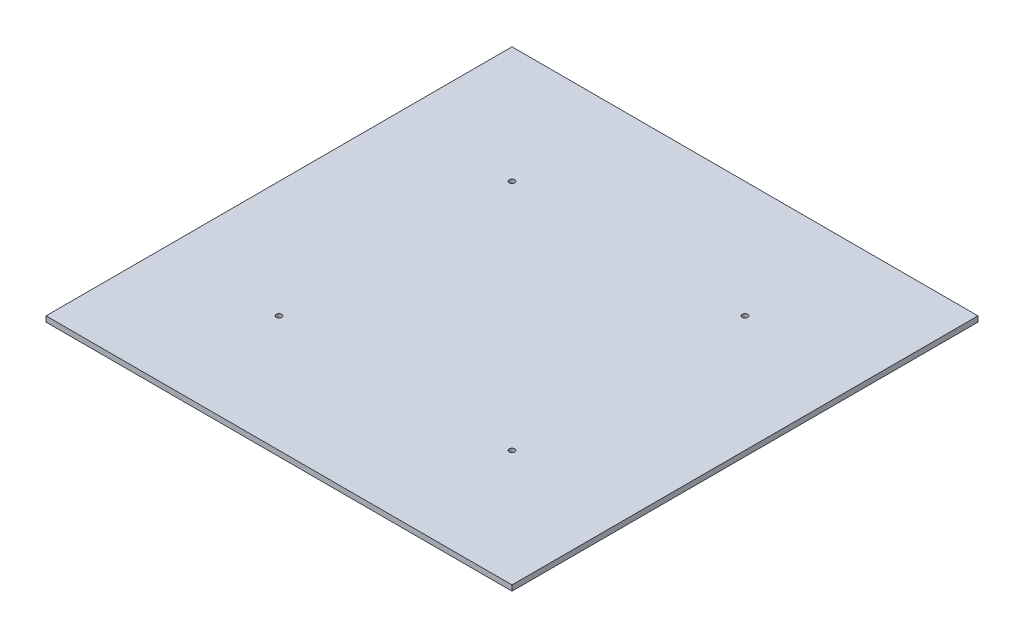
ISO-10303-21;
HEADER;
FILE_DESCRIPTION(('STEP AP214'),'2;1');
FILE_NAME('part.step','',(''),(''),'','','');
FILE_SCHEMA(('AUTOMOTIVE_DESIGN { 1 0 10303 214 1 1 1 1 }'));
ENDSEC;
DATA;
#1=APPLICATION_CONTEXT('core data for automotive mechanical design processes');
#2=APPLICATION_PROTOCOL_DEFINITION('international standard','automotive_design',2000,#1);
#3=PRODUCT_CONTEXT('',#1,'mechanical');
#4=PRODUCT('Part','Part','',(#3));
#5=PRODUCT_RELATED_PRODUCT_CATEGORY('part','',(#4));
#6=PRODUCT_DEFINITION_FORMATION('','',#4);
#7=PRODUCT_DEFINITION_CONTEXT('part definition',#1,'design');
#8=PRODUCT_DEFINITION('design','',#6,#7);
#9=PRODUCT_DEFINITION_SHAPE('','',#8);
#10=(LENGTH_UNIT() NAMED_UNIT(*) SI_UNIT(.MILLI.,.METRE.));
#11=(NAMED_UNIT(*) PLANE_ANGLE_UNIT() SI_UNIT($,.RADIAN.));
#12=(NAMED_UNIT(*) SI_UNIT($,.STERADIAN.) SOLID_ANGLE_UNIT());
#13=UNCERTAINTY_MEASURE_WITH_UNIT(LENGTH_MEASURE(1.E-05),#10,'distance_accuracy_value','');
#14=(GEOMETRIC_REPRESENTATION_CONTEXT(3) GLOBAL_UNCERTAINTY_ASSIGNED_CONTEXT((#13)) GLOBAL_UNIT_ASSIGNED_CONTEXT((#10,
#11,#12)) REPRESENTATION_CONTEXT('',''));
#15=CARTESIAN_POINT('',(0.,0.,0.));
#16=DIRECTION('',(0.,0.,1.));
#17=DIRECTION('',(1.,0.,0.));
#18=AXIS2_PLACEMENT_3D('',#15,#16,#17);
#19=CARTESIAN_POINT('',(0.,1.5,0.));
#20=DIRECTION('',(0.,-1.,0.));
#21=DIRECTION('',(0.,0.,-1.));
#22=AXIS2_PLACEMENT_3D('',#19,#20,#21);
#23=PLANE('',#22);
#24=DIRECTION('',(0.,0.,-1.));
#25=VECTOR('',#24,1.);
#26=CARTESIAN_POINT('',(128.,1.5,128.));
#27=LINE('',#26,#25);
#28=CARTESIAN_POINT('',(128.,1.5,128.));
#29=VERTEX_POINT('',#28);
#30=CARTESIAN_POINT('',(128.,1.5,-128.));
#31=VERTEX_POINT('',#30);
#32=EDGE_CURVE('E84',#29,#31,#27,.T.);
#33=ORIENTED_EDGE('',*,*,#32,.T.);
#34=DIRECTION('',(-1.,0.,0.));
#35=VECTOR('',#34,1.);
#36=CARTESIAN_POINT('',(-128.,1.5,-128.));
#37=LINE('',#36,#35);
#38=CARTESIAN_POINT('',(-128.,1.5,-128.));
#39=VERTEX_POINT('',#38);
#40=EDGE_CURVE('E79',#31,#39,#37,.T.);
#41=ORIENTED_EDGE('',*,*,#40,.T.);
#42=DIRECTION('',(0.,0.,1.));
#43=VECTOR('',#42,1.);
#44=CARTESIAN_POINT('',(-128.,1.5,128.));
#45=LINE('',#44,#43);
#46=CARTESIAN_POINT('',(-128.,1.5,128.));
#47=VERTEX_POINT('',#46);
#48=EDGE_CURVE('E82',#39,#47,#45,.T.);
#49=ORIENTED_EDGE('',*,*,#48,.T.);
#50=DIRECTION('',(1.,0.,0.));
#51=VECTOR('',#50,1.);
#52=CARTESIAN_POINT('',(-128.,1.5,128.));
#53=LINE('',#52,#51);
#54=EDGE_CURVE('E49',#47,#29,#53,.T.);
#55=ORIENTED_EDGE('',*,*,#54,.T.);
#56=EDGE_LOOP('',(#33,#41,#49,#55));
#57=FACE_BOUND('',#56,.T.);
#58=CARTESIAN_POINT('',(-64.,1.5,-64.));
#59=DIRECTION('',(0.,1.,0.));
#60=DIRECTION('',(0.,0.,1.));
#61=AXIS2_PLACEMENT_3D('',#58,#59,#60);
#62=CIRCLE('',#61,1.5);
#63=CARTESIAN_POINT('',(-64.,1.5,-62.5));
#64=VERTEX_POINT('',#63);
#65=EDGE_CURVE('E99',#64,#64,#62,.T.);
#66=ORIENTED_EDGE('',*,*,#65,.F.);
#67=EDGE_LOOP('',(#66));
#68=FACE_BOUND('',#67,.T.);
#69=CARTESIAN_POINT('',(64.,1.5,-64.));
#70=DIRECTION('',(0.,1.,0.));
#71=DIRECTION('',(0.,0.,1.));
#72=AXIS2_PLACEMENT_3D('',#69,#70,#71);
#73=CIRCLE('',#72,1.5);
#74=CARTESIAN_POINT('',(64.,1.5,-62.5));
#75=VERTEX_POINT('',#74);
#76=EDGE_CURVE('E114',#75,#75,#73,.T.);
#77=ORIENTED_EDGE('',*,*,#76,.F.);
#78=EDGE_LOOP('',(#77));
#79=FACE_BOUND('',#78,.T.);
#80=CARTESIAN_POINT('',(64.,1.5,64.));
#81=DIRECTION('',(0.,1.,0.));
#82=DIRECTION('',(0.,0.,1.));
#83=AXIS2_PLACEMENT_3D('',#80,#81,#82);
#84=CIRCLE('',#83,1.5);
#85=CARTESIAN_POINT('',(64.,1.5,65.5));
#86=VERTEX_POINT('',#85);
#87=EDGE_CURVE('E120',#86,#86,#84,.T.);
#88=ORIENTED_EDGE('',*,*,#87,.F.);
#89=EDGE_LOOP('',(#88));
#90=FACE_BOUND('',#89,.T.);
#91=CARTESIAN_POINT('',(-64.,1.5,64.));
#92=DIRECTION('',(0.,1.,0.));
#93=DIRECTION('',(0.,0.,1.));
#94=AXIS2_PLACEMENT_3D('',#91,#92,#93);
#95=CIRCLE('',#94,1.5);
#96=CARTESIAN_POINT('',(-64.,1.5,65.5));
#97=VERTEX_POINT('',#96);
#98=EDGE_CURVE('E126',#97,#97,#95,.T.);
#99=ORIENTED_EDGE('',*,*,#98,.F.);
#100=EDGE_LOOP('',(#99));
#101=FACE_BOUND('',#100,.T.);
#102=ADVANCED_FACE('F32',(#57,#68,#79,#90,#101),#23,.F.);
#103=CARTESIAN_POINT('',(0.,-1.5,0.));
#104=DIRECTION('',(0.,-1.,0.));
#105=DIRECTION('',(0.,0.,-1.));
#106=AXIS2_PLACEMENT_3D('',#103,#104,#105);
#107=PLANE('',#106);
#108=CARTESIAN_POINT('',(64.,-1.5,64.));
#109=DIRECTION('',(0.,1.,0.));
#110=DIRECTION('',(0.,0.,1.));
#111=AXIS2_PLACEMENT_3D('',#108,#109,#110);
#112=CIRCLE('',#111,1.5);
#113=CARTESIAN_POINT('',(64.,-1.5,65.5));
#114=VERTEX_POINT('',#113);
#115=EDGE_CURVE('E123',#114,#114,#112,.T.);
#116=ORIENTED_EDGE('',*,*,#115,.T.);
#117=EDGE_LOOP('',(#116));
#118=FACE_BOUND('',#117,.T.);
#119=CARTESIAN_POINT('',(-64.,-1.5,-64.));
#120=DIRECTION('',(0.,1.,0.));
#121=DIRECTION('',(0.,0.,1.));
#122=AXIS2_PLACEMENT_3D('',#119,#120,#121);
#123=CIRCLE('',#122,1.5);
#124=CARTESIAN_POINT('',(-64.,-1.5,-62.5));
#125=VERTEX_POINT('',#124);
#126=EDGE_CURVE('E111',#125,#125,#123,.T.);
#127=ORIENTED_EDGE('',*,*,#126,.T.);
#128=EDGE_LOOP('',(#127));
#129=FACE_BOUND('',#128,.T.);
#130=DIRECTION('',(0.,0.,-1.));
#131=VECTOR('',#130,1.);
#132=CARTESIAN_POINT('',(128.,-1.5,128.));
#133=LINE('',#132,#131);
#134=CARTESIAN_POINT('',(128.,-1.5,128.));
#135=VERTEX_POINT('',#134);
#136=CARTESIAN_POINT('',(128.,-1.5,-128.));
#137=VERTEX_POINT('',#136);
#138=EDGE_CURVE('E96',#135,#137,#133,.T.);
#139=ORIENTED_EDGE('',*,*,#138,.F.);
#140=DIRECTION('',(1.,0.,0.));
#141=VECTOR('',#140,1.);
#142=CARTESIAN_POINT('',(-128.,-1.5,128.));
#143=LINE('',#142,#141);
#144=CARTESIAN_POINT('',(-128.,-1.5,128.));
#145=VERTEX_POINT('',#144);
#146=EDGE_CURVE('E72',#145,#135,#143,.T.);
#147=ORIENTED_EDGE('',*,*,#146,.F.);
#148=DIRECTION('',(0.,0.,1.));
#149=VECTOR('',#148,1.);
#150=CARTESIAN_POINT('',(-128.,-1.5,128.));
#151=LINE('',#150,#149);
#152=CARTESIAN_POINT('',(-128.,-1.5,-128.));
#153=VERTEX_POINT('',#152);
#154=EDGE_CURVE('E66',#153,#145,#151,.T.);
#155=ORIENTED_EDGE('',*,*,#154,.F.);
#156=DIRECTION('',(-1.,0.,0.));
#157=VECTOR('',#156,1.);
#158=CARTESIAN_POINT('',(-128.,-1.5,-128.));
#159=LINE('',#158,#157);
#160=EDGE_CURVE('E88',#137,#153,#159,.T.);
#161=ORIENTED_EDGE('',*,*,#160,.F.);
#162=EDGE_LOOP('',(#139,#147,#155,#161));
#163=FACE_BOUND('',#162,.T.);
#164=CARTESIAN_POINT('',(64.,-1.5,-64.));
#165=DIRECTION('',(0.,1.,0.));
#166=DIRECTION('',(0.,0.,1.));
#167=AXIS2_PLACEMENT_3D('',#164,#165,#166);
#168=CIRCLE('',#167,1.5);
#169=CARTESIAN_POINT('',(64.,-1.5,-62.5));
#170=VERTEX_POINT('',#169);
#171=EDGE_CURVE('E117',#170,#170,#168,.T.);
#172=ORIENTED_EDGE('',*,*,#171,.T.);
#173=EDGE_LOOP('',(#172));
#174=FACE_BOUND('',#173,.T.);
#175=CARTESIAN_POINT('',(-64.,-1.5,64.));
#176=DIRECTION('',(0.,1.,0.));
#177=DIRECTION('',(0.,0.,1.));
#178=AXIS2_PLACEMENT_3D('',#175,#176,#177);
#179=CIRCLE('',#178,1.5);
#180=CARTESIAN_POINT('',(-64.,-1.5,65.5));
#181=VERTEX_POINT('',#180);
#182=EDGE_CURVE('E129',#181,#181,#179,.T.);
#183=ORIENTED_EDGE('',*,*,#182,.T.);
#184=EDGE_LOOP('',(#183));
#185=FACE_BOUND('',#184,.T.);
#186=ADVANCED_FACE('F107',(#118,#129,#163,#174,#185),#107,.T.);
#187=CARTESIAN_POINT('',(128.,1.5,128.));
#188=DIRECTION('',(-1.,0.,0.));
#189=DIRECTION('',(0.,0.,1.));
#190=AXIS2_PLACEMENT_3D('',#187,#188,#189);
#191=PLANE('',#190);
#192=ORIENTED_EDGE('',*,*,#138,.T.);
#193=DIRECTION('',(0.,-1.,0.));
#194=VECTOR('',#193,1.);
#195=CARTESIAN_POINT('',(128.,1.5,-128.));
#196=LINE('',#195,#194);
#197=EDGE_CURVE('E11',#31,#137,#196,.T.);
#198=ORIENTED_EDGE('',*,*,#197,.F.);
#199=ORIENTED_EDGE('',*,*,#32,.F.);
#200=DIRECTION('',(0.,-1.,0.));
#201=VECTOR('',#200,1.);
#202=CARTESIAN_POINT('',(128.,1.5,128.));
#203=LINE('',#202,#201);
#204=EDGE_CURVE('E92',#29,#135,#203,.T.);
#205=ORIENTED_EDGE('',*,*,#204,.T.);
#206=EDGE_LOOP('',(#192,#198,#199,#205));
#207=FACE_BOUND('',#206,.T.);
#208=ADVANCED_FACE('F34',(#207),#191,.F.);
#209=CARTESIAN_POINT('',(-128.,1.5,-128.));
#210=DIRECTION('',(0.,0.,1.));
#211=DIRECTION('',(1.,0.,0.));
#212=AXIS2_PLACEMENT_3D('',#209,#210,#211);
#213=PLANE('',#212);
#214=ORIENTED_EDGE('',*,*,#160,.T.);
#215=DIRECTION('',(0.,-1.,0.));
#216=VECTOR('',#215,1.);
#217=CARTESIAN_POINT('',(-128.,1.5,-128.));
#218=LINE('',#217,#216);
#219=EDGE_CURVE('E41',#39,#153,#218,.T.);
#220=ORIENTED_EDGE('',*,*,#219,.F.);
#221=ORIENTED_EDGE('',*,*,#40,.F.);
#222=ORIENTED_EDGE('',*,*,#197,.T.);
#223=EDGE_LOOP('',(#214,#220,#221,#222));
#224=FACE_BOUND('',#223,.T.);
#225=ADVANCED_FACE('F87',(#224),#213,.F.);
#226=CARTESIAN_POINT('',(-128.,1.5,128.));
#227=DIRECTION('',(1.,0.,0.));
#228=DIRECTION('',(0.,0.,-1.));
#229=AXIS2_PLACEMENT_3D('',#226,#227,#228);
#230=PLANE('',#229);
#231=ORIENTED_EDGE('',*,*,#154,.T.);
#232=DIRECTION('',(0.,-1.,0.));
#233=VECTOR('',#232,1.);
#234=CARTESIAN_POINT('',(-128.,1.5,128.));
#235=LINE('',#234,#233);
#236=EDGE_CURVE('E89',#47,#145,#235,.T.);
#237=ORIENTED_EDGE('',*,*,#236,.F.);
#238=ORIENTED_EDGE('',*,*,#48,.F.);
#239=ORIENTED_EDGE('',*,*,#219,.T.);
#240=EDGE_LOOP('',(#231,#237,#238,#239));
#241=FACE_BOUND('',#240,.T.);
#242=ADVANCED_FACE('F90',(#241),#230,.F.);
#243=CARTESIAN_POINT('',(-128.,1.5,128.));
#244=DIRECTION('',(0.,0.,-1.));
#245=DIRECTION('',(-1.,0.,0.));
#246=AXIS2_PLACEMENT_3D('',#243,#244,#245);
#247=PLANE('',#246);
#248=ORIENTED_EDGE('',*,*,#146,.T.);
#249=ORIENTED_EDGE('',*,*,#204,.F.);
#250=ORIENTED_EDGE('',*,*,#54,.F.);
#251=ORIENTED_EDGE('',*,*,#236,.T.);
#252=EDGE_LOOP('',(#248,#249,#250,#251));
#253=FACE_BOUND('',#252,.T.);
#254=ADVANCED_FACE('F104',(#253),#247,.F.);
#255=CARTESIAN_POINT('',(-64.,1.5,-64.));
#256=DIRECTION('',(0.,-1.,0.));
#257=DIRECTION('',(0.,0.,-1.));
#258=AXIS2_PLACEMENT_3D('',#255,#256,#257);
#259=CYLINDRICAL_SURFACE('',#258,1.5);
#260=ORIENTED_EDGE('',*,*,#65,.T.);
#261=EDGE_LOOP('',(#260));
#262=FACE_BOUND('',#261,.T.);
#263=ORIENTED_EDGE('',*,*,#126,.F.);
#264=EDGE_LOOP('',(#263));
#265=FACE_BOUND('',#264,.T.);
#266=ADVANCED_FACE('F146',(#262,#265),#259,.F.);
#267=CARTESIAN_POINT('',(64.,1.5,-64.));
#268=DIRECTION('',(0.,-1.,0.));
#269=DIRECTION('',(0.,0.,-1.));
#270=AXIS2_PLACEMENT_3D('',#267,#268,#269);
#271=CYLINDRICAL_SURFACE('',#270,1.5);
#272=ORIENTED_EDGE('',*,*,#76,.T.);
#273=EDGE_LOOP('',(#272));
#274=FACE_BOUND('',#273,.T.);
#275=ORIENTED_EDGE('',*,*,#171,.F.);
#276=EDGE_LOOP('',(#275));
#277=FACE_BOUND('',#276,.T.);
#278=ADVANCED_FACE('F192',(#274,#277),#271,.F.);
#279=CARTESIAN_POINT('',(64.,1.5,64.));
#280=DIRECTION('',(0.,-1.,0.));
#281=DIRECTION('',(0.,0.,-1.));
#282=AXIS2_PLACEMENT_3D('',#279,#280,#281);
#283=CYLINDRICAL_SURFACE('',#282,1.5);
#284=ORIENTED_EDGE('',*,*,#87,.T.);
#285=EDGE_LOOP('',(#284));
#286=FACE_BOUND('',#285,.T.);
#287=ORIENTED_EDGE('',*,*,#115,.F.);
#288=EDGE_LOOP('',(#287));
#289=FACE_BOUND('',#288,.T.);
#290=ADVANCED_FACE('F200',(#286,#289),#283,.F.);
#291=CARTESIAN_POINT('',(-64.,1.5,64.));
#292=DIRECTION('',(0.,-1.,0.));
#293=DIRECTION('',(0.,0.,-1.));
#294=AXIS2_PLACEMENT_3D('',#291,#292,#293);
#295=CYLINDRICAL_SURFACE('',#294,1.5);
#296=ORIENTED_EDGE('',*,*,#98,.T.);
#297=EDGE_LOOP('',(#296));
#298=FACE_BOUND('',#297,.T.);
#299=ORIENTED_EDGE('',*,*,#182,.F.);
#300=EDGE_LOOP('',(#299));
#301=FACE_BOUND('',#300,.T.);
#302=ADVANCED_FACE('F135',(#298,#301),#295,.F.);
#303=CLOSED_SHELL('',(#102,#186,#208,#225,#242,#254,#266,#278,#290,#302));
#304=MANIFOLD_SOLID_BREP('B2',#303);
#305=ADVANCED_BREP_SHAPE_REPRESENTATION('',(#18,#304),#14);
#306=SHAPE_DEFINITION_REPRESENTATION(#9,#305);
ENDSEC;
END-ISO-10303-21;
